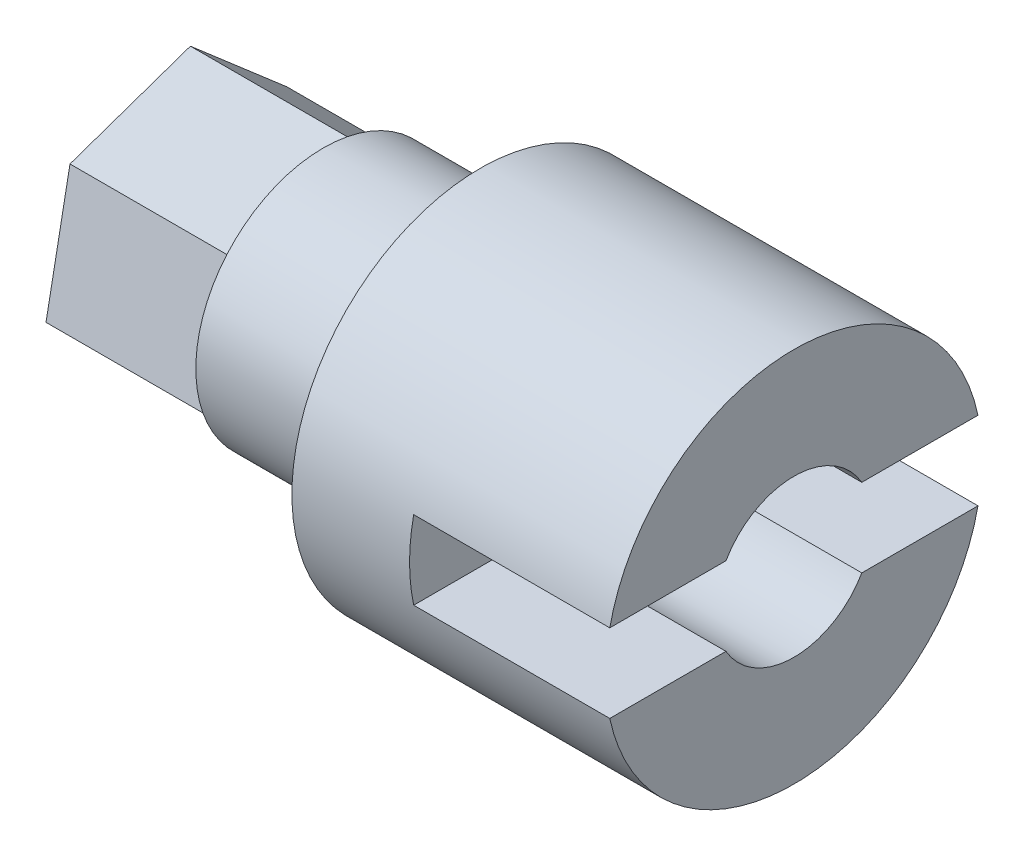
ISO-10303-21;
HEADER;
FILE_DESCRIPTION(('STEP AP214'),'2;1');
FILE_NAME('part.step','',(''),(''),'','','');
FILE_SCHEMA(('AUTOMOTIVE_DESIGN { 1 0 10303 214 1 1 1 1 }'));
ENDSEC;
DATA;
#1=APPLICATION_CONTEXT('core data for automotive mechanical design processes');
#2=APPLICATION_PROTOCOL_DEFINITION('international standard','automotive_design',2000,#1);
#3=PRODUCT_CONTEXT('',#1,'mechanical');
#4=PRODUCT('Part','Part','',(#3));
#5=PRODUCT_RELATED_PRODUCT_CATEGORY('part','',(#4));
#6=PRODUCT_DEFINITION_FORMATION('','',#4);
#7=PRODUCT_DEFINITION_CONTEXT('part definition',#1,'design');
#8=PRODUCT_DEFINITION('design','',#6,#7);
#9=PRODUCT_DEFINITION_SHAPE('','',#8);
#10=(LENGTH_UNIT() NAMED_UNIT(*) SI_UNIT(.MILLI.,.METRE.));
#11=(NAMED_UNIT(*) PLANE_ANGLE_UNIT() SI_UNIT($,.RADIAN.));
#12=(NAMED_UNIT(*) SI_UNIT($,.STERADIAN.) SOLID_ANGLE_UNIT());
#13=UNCERTAINTY_MEASURE_WITH_UNIT(LENGTH_MEASURE(1.E-05),#10,'distance_accuracy_value','');
#14=(GEOMETRIC_REPRESENTATION_CONTEXT(3) GLOBAL_UNCERTAINTY_ASSIGNED_CONTEXT((#13)) GLOBAL_UNIT_ASSIGNED_CONTEXT((#10,
#11,#12)) REPRESENTATION_CONTEXT('',''));
#15=CARTESIAN_POINT('',(0.,0.,0.));
#16=DIRECTION('',(0.,0.,1.));
#17=DIRECTION('',(1.,0.,0.));
#18=AXIS2_PLACEMENT_3D('',#15,#16,#17);
#19=CARTESIAN_POINT('',(-8.,0.,0.));
#20=DIRECTION('',(1.,0.,0.));
#21=DIRECTION('',(0.,0.,-1.));
#22=AXIS2_PLACEMENT_3D('',#19,#20,#21);
#23=CYLINDRICAL_SURFACE('',#22,3.25);
#24=CARTESIAN_POINT('',(0.,0.,0.));
#25=DIRECTION('',(1.,0.,0.));
#26=DIRECTION('',(0.,0.,-1.));
#27=AXIS2_PLACEMENT_3D('',#24,#25,#26);
#28=CIRCLE('',#27,3.25);
#29=CARTESIAN_POINT('',(0.,0.,-3.25));
#30=VERTEX_POINT('',#29);
#31=EDGE_CURVE('E179',#30,#30,#28,.F.);
#32=ORIENTED_EDGE('',*,*,#31,.T.);
#33=EDGE_LOOP('',(#32));
#34=FACE_BOUND('',#33,.T.);
#35=CARTESIAN_POINT('',(-4.,0.,0.));
#36=DIRECTION('',(-1.,0.,0.));
#37=DIRECTION('',(0.,0.,1.));
#38=AXIS2_PLACEMENT_3D('',#35,#36,#37);
#39=CIRCLE('',#38,3.25);
#40=CARTESIAN_POINT('',(-4.,1.06629726237297,-3.07009937107187));
#41=VERTEX_POINT('',#40);
#42=CARTESIAN_POINT('',(-4.,-2.12563541630438,-2.45849020273673));
#43=VERTEX_POINT('',#42);
#44=EDGE_CURVE('E12',#41,#43,#39,.T.);
#45=ORIENTED_EDGE('',*,*,#44,.F.);
#46=CARTESIAN_POINT('',(-4.,3.19193267867735,-0.611609168335137));
#47=VERTEX_POINT('',#46);
#48=EDGE_CURVE('E45',#47,#41,#39,.T.);
#49=ORIENTED_EDGE('',*,*,#48,.F.);
#50=CARTESIAN_POINT('',(-4.,2.12563541630438,2.45849020273673));
#51=VERTEX_POINT('',#50);
#52=EDGE_CURVE('E147',#51,#47,#39,.T.);
#53=ORIENTED_EDGE('',*,*,#52,.F.);
#54=CARTESIAN_POINT('',(-4.,-1.06629726237298,3.07009937107187));
#55=VERTEX_POINT('',#54);
#56=EDGE_CURVE('E180',#55,#51,#39,.T.);
#57=ORIENTED_EDGE('',*,*,#56,.F.);
#58=CARTESIAN_POINT('',(-4.,-3.19193267867735,0.611609168335137));
#59=VERTEX_POINT('',#58);
#60=EDGE_CURVE('E177',#59,#55,#39,.T.);
#61=ORIENTED_EDGE('',*,*,#60,.F.);
#62=EDGE_CURVE('E40',#43,#59,#39,.T.);
#63=ORIENTED_EDGE('',*,*,#62,.F.);
#64=EDGE_LOOP('',(#45,#49,#53,#57,#61,#63));
#65=FACE_BOUND('',#64,.T.);
#66=ADVANCED_FACE('F36',(#34,#65),#23,.T.);
#67=CARTESIAN_POINT('',(-8.,0.,0.));
#68=DIRECTION('',(-1.,0.,0.));
#69=DIRECTION('',(0.,0.,1.));
#70=AXIS2_PLACEMENT_3D('',#67,#68,#69);
#71=PLANE('',#70);
#72=CARTESIAN_POINT('',(-8.,0.,0.));
#73=DIRECTION('',(-1.,0.,0.));
#74=DIRECTION('',(0.,0.,1.));
#75=AXIS2_PLACEMENT_3D('',#72,#73,#74);
#76=CIRCLE('',#75,1.35);
#77=CARTESIAN_POINT('',(-8.,0.,1.35));
#78=VERTEX_POINT('',#77);
#79=EDGE_CURVE('E245',#78,#78,#76,.T.);
#80=ORIENTED_EDGE('',*,*,#79,.F.);
#81=EDGE_LOOP('',(#80));
#82=FACE_BOUND('',#81,.T.);
#83=DIRECTION('',(0.,0.328091465345531,-0.944645960329806));
#84=VECTOR('',#83,1.);
#85=CARTESIAN_POINT('',(-8.,2.12563541630438,2.45849020273673));
#86=LINE('',#85,#84);
#87=CARTESIAN_POINT('',(-8.,2.12563541630438,2.45849020273673));
#88=VERTEX_POINT('',#87);
#89=CARTESIAN_POINT('',(-8.,3.19193267867735,-0.611609168335137));
#90=VERTEX_POINT('',#89);
#91=EDGE_CURVE('E172',#88,#90,#86,.T.);
#92=ORIENTED_EDGE('',*,*,#91,.T.);
#93=DIRECTION('',(0.,-0.654041666555194,-0.756458523918995));
#94=VECTOR('',#93,1.);
#95=CARTESIAN_POINT('',(-8.,3.19193267867735,-0.611609168335137));
#96=LINE('',#95,#94);
#97=CARTESIAN_POINT('',(-8.,1.06629726237297,-3.07009937107187));
#98=VERTEX_POINT('',#97);
#99=EDGE_CURVE('E266',#90,#98,#96,.T.);
#100=ORIENTED_EDGE('',*,*,#99,.T.);
#101=DIRECTION('',(0.,-0.982133131900725,0.188187436410812));
#102=VECTOR('',#101,1.);
#103=CARTESIAN_POINT('',(-8.,1.06629726237297,-3.07009937107187));
#104=LINE('',#103,#102);
#105=CARTESIAN_POINT('',(-8.,-2.12563541630439,-2.45849020273673));
#106=VERTEX_POINT('',#105);
#107=EDGE_CURVE('E157',#98,#106,#104,.T.);
#108=ORIENTED_EDGE('',*,*,#107,.T.);
#109=DIRECTION('',(0.,-0.328091465345531,0.944645960329806));
#110=VECTOR('',#109,1.);
#111=CARTESIAN_POINT('',(-8.,-2.12563541630438,-2.45849020273673));
#112=LINE('',#111,#110);
#113=CARTESIAN_POINT('',(-8.,-3.19193267867735,0.611609168335137));
#114=VERTEX_POINT('',#113);
#115=EDGE_CURVE('E60',#106,#114,#112,.T.);
#116=ORIENTED_EDGE('',*,*,#115,.T.);
#117=DIRECTION('',(0.,0.654041666555194,0.756458523918995));
#118=VECTOR('',#117,1.);
#119=CARTESIAN_POINT('',(-8.,-3.19193267867735,0.611609168335137));
#120=LINE('',#119,#118);
#121=CARTESIAN_POINT('',(-8.,-1.06629726237298,3.07009937107187));
#122=VERTEX_POINT('',#121);
#123=EDGE_CURVE('E261',#114,#122,#120,.T.);
#124=ORIENTED_EDGE('',*,*,#123,.T.);
#125=DIRECTION('',(0.,0.982133131900725,-0.188187436410811));
#126=VECTOR('',#125,1.);
#127=CARTESIAN_POINT('',(-8.,-1.06629726237298,3.07009937107187));
#128=LINE('',#127,#126);
#129=EDGE_CURVE('E258',#122,#88,#128,.T.);
#130=ORIENTED_EDGE('',*,*,#129,.T.);
#131=EDGE_LOOP('',(#92,#100,#108,#116,#124,#130));
#132=FACE_BOUND('',#131,.T.);
#133=ADVANCED_FACE('F290',(#82,#132),#71,.T.);
#134=CARTESIAN_POINT('',(8.,0.,0.));
#135=DIRECTION('',(-1.,0.,0.));
#136=DIRECTION('',(0.,0.,1.));
#137=AXIS2_PLACEMENT_3D('',#134,#135,#136);
#138=CYLINDRICAL_SURFACE('',#137,2.);
#139=DIRECTION('',(-1.,0.,0.));
#140=VECTOR('',#139,1.);
#141=CARTESIAN_POINT('',(8.,1.,1.73205080756888));
#142=LINE('',#141,#140);
#143=CARTESIAN_POINT('',(3.,1.,1.73205080756888));
#144=VERTEX_POINT('',#143);
#145=CARTESIAN_POINT('',(8.,1.,1.73205080756888));
#146=VERTEX_POINT('',#145);
#147=EDGE_CURVE('E182',#144,#146,#142,.F.);
#148=ORIENTED_EDGE('',*,*,#147,.F.);
#149=CARTESIAN_POINT('',(3.,0.,0.));
#150=DIRECTION('',(1.,0.,0.));
#151=DIRECTION('',(0.,0.,-1.));
#152=AXIS2_PLACEMENT_3D('',#149,#150,#151);
#153=CIRCLE('',#152,2.);
#154=CARTESIAN_POINT('',(3.,-1.,1.73205080756888));
#155=VERTEX_POINT('',#154);
#156=EDGE_CURVE('E190',#144,#155,#153,.T.);
#157=ORIENTED_EDGE('',*,*,#156,.T.);
#158=DIRECTION('',(-1.,0.,0.));
#159=VECTOR('',#158,1.);
#160=CARTESIAN_POINT('',(8.,-1.,1.73205080756888));
#161=LINE('',#160,#159);
#162=CARTESIAN_POINT('',(8.,-1.,1.73205080756888));
#163=VERTEX_POINT('',#162);
#164=EDGE_CURVE('E185',#163,#155,#161,.T.);
#165=ORIENTED_EDGE('',*,*,#164,.F.);
#166=CARTESIAN_POINT('',(8.,0.,0.));
#167=DIRECTION('',(1.,0.,0.));
#168=DIRECTION('',(0.,0.,-1.));
#169=AXIS2_PLACEMENT_3D('',#166,#167,#168);
#170=CIRCLE('',#169,2.);
#171=CARTESIAN_POINT('',(8.,-1.,-1.73205080756888));
#172=VERTEX_POINT('',#171);
#173=EDGE_CURVE('E209',#163,#172,#170,.T.);
#174=ORIENTED_EDGE('',*,*,#173,.T.);
#175=DIRECTION('',(-1.,0.,0.));
#176=VECTOR('',#175,1.);
#177=CARTESIAN_POINT('',(8.,-1.,-1.73205080756888));
#178=LINE('',#177,#176);
#179=CARTESIAN_POINT('',(3.,-1.,-1.73205080756888));
#180=VERTEX_POINT('',#179);
#181=EDGE_CURVE('E194',#180,#172,#178,.F.);
#182=ORIENTED_EDGE('',*,*,#181,.F.);
#183=CARTESIAN_POINT('',(3.,1.,-1.73205080756888));
#184=VERTEX_POINT('',#183);
#185=EDGE_CURVE('E196',#180,#184,#153,.T.);
#186=ORIENTED_EDGE('',*,*,#185,.T.);
#187=DIRECTION('',(-1.,0.,0.));
#188=VECTOR('',#187,1.);
#189=CARTESIAN_POINT('',(8.,1.,-1.73205080756888));
#190=LINE('',#189,#188);
#191=CARTESIAN_POINT('',(8.,1.,-1.73205080756888));
#192=VERTEX_POINT('',#191);
#193=EDGE_CURVE('E191',#192,#184,#190,.T.);
#194=ORIENTED_EDGE('',*,*,#193,.F.);
#195=EDGE_CURVE('E204',#192,#146,#170,.T.);
#196=ORIENTED_EDGE('',*,*,#195,.T.);
#197=EDGE_LOOP('',(#148,#157,#165,#174,#182,#186,#194,#196));
#198=FACE_BOUND('',#197,.T.);
#199=CARTESIAN_POINT('',(2.,0.,0.));
#200=DIRECTION('',(-1.,0.,0.));
#201=DIRECTION('',(0.,0.,1.));
#202=AXIS2_PLACEMENT_3D('',#199,#200,#201);
#203=CIRCLE('',#202,2.);
#204=CARTESIAN_POINT('',(2.,0.,2.));
#205=VERTEX_POINT('',#204);
#206=EDGE_CURVE('E232',#205,#205,#203,.T.);
#207=ORIENTED_EDGE('',*,*,#206,.T.);
#208=EDGE_LOOP('',(#207));
#209=FACE_BOUND('',#208,.T.);
#210=ADVANCED_FACE('F296',(#198,#209),#138,.F.);
#211=CARTESIAN_POINT('',(8.,0.,0.));
#212=DIRECTION('',(1.,0.,0.));
#213=DIRECTION('',(0.,0.,-1.));
#214=AXIS2_PLACEMENT_3D('',#211,#212,#213);
#215=PLANE('',#214);
#216=DIRECTION('',(0.,0.,1.));
#217=VECTOR('',#216,1.);
#218=CARTESIAN_POINT('',(8.,1.,5.97471437399122));
#219=LINE('',#218,#217);
#220=CARTESIAN_POINT('',(8.,1.,-4.6946778377222));
#221=VERTEX_POINT('',#220);
#222=EDGE_CURVE('E228',#221,#192,#219,.T.);
#223=ORIENTED_EDGE('',*,*,#222,.F.);
#224=CARTESIAN_POINT('',(8.,0.,0.));
#225=DIRECTION('',(1.,0.,0.));
#226=DIRECTION('',(0.,0.,-1.));
#227=AXIS2_PLACEMENT_3D('',#224,#225,#226);
#228=CIRCLE('',#227,4.8);
#229=CARTESIAN_POINT('',(8.,1.,4.6946778377222));
#230=VERTEX_POINT('',#229);
#231=EDGE_CURVE('E199',#221,#230,#228,.T.);
#232=ORIENTED_EDGE('',*,*,#231,.T.);
#233=EDGE_CURVE('E226',#146,#230,#219,.T.);
#234=ORIENTED_EDGE('',*,*,#233,.F.);
#235=ORIENTED_EDGE('',*,*,#195,.F.);
#236=EDGE_LOOP('',(#223,#232,#234,#235));
#237=FACE_BOUND('',#236,.T.);
#238=ADVANCED_FACE('F322',(#237),#215,.T.);
#239=DIRECTION('',(0.,0.,-1.));
#240=VECTOR('',#239,1.);
#241=CARTESIAN_POINT('',(8.,-1.,5.97471437399122));
#242=LINE('',#241,#240);
#243=CARTESIAN_POINT('',(8.,-1.,4.6946778377222));
#244=VERTEX_POINT('',#243);
#245=EDGE_CURVE('E229',#244,#163,#242,.T.);
#246=ORIENTED_EDGE('',*,*,#245,.F.);
#247=CARTESIAN_POINT('',(8.,-1.,-4.6946778377222));
#248=VERTEX_POINT('',#247);
#249=EDGE_CURVE('E203',#244,#248,#228,.T.);
#250=ORIENTED_EDGE('',*,*,#249,.T.);
#251=EDGE_CURVE('E230',#172,#248,#242,.T.);
#252=ORIENTED_EDGE('',*,*,#251,.F.);
#253=ORIENTED_EDGE('',*,*,#173,.F.);
#254=EDGE_LOOP('',(#246,#250,#252,#253));
#255=FACE_BOUND('',#254,.T.);
#256=ADVANCED_FACE('F324',(#255),#215,.T.);
#257=CARTESIAN_POINT('',(0.,0.,0.));
#258=DIRECTION('',(1.,0.,0.));
#259=DIRECTION('',(0.,0.,-1.));
#260=AXIS2_PLACEMENT_3D('',#257,#258,#259);
#261=PLANE('',#260);
#262=ORIENTED_EDGE('',*,*,#31,.F.);
#263=EDGE_LOOP('',(#262));
#264=FACE_BOUND('',#263,.T.);
#265=CARTESIAN_POINT('',(0.,0.,0.));
#266=DIRECTION('',(1.,0.,0.));
#267=DIRECTION('',(0.,0.,-1.));
#268=AXIS2_PLACEMENT_3D('',#265,#266,#267);
#269=CIRCLE('',#268,4.8);
#270=CARTESIAN_POINT('',(0.,0.,-4.8));
#271=VERTEX_POINT('',#270);
#272=EDGE_CURVE('E200',#271,#271,#269,.T.);
#273=ORIENTED_EDGE('',*,*,#272,.F.);
#274=EDGE_LOOP('',(#273));
#275=FACE_BOUND('',#274,.T.);
#276=ADVANCED_FACE('F326',(#264,#275),#261,.F.);
#277=CARTESIAN_POINT('',(8.,0.,0.));
#278=DIRECTION('',(-1.,0.,0.));
#279=DIRECTION('',(0.,0.,1.));
#280=AXIS2_PLACEMENT_3D('',#277,#278,#279);
#281=CYLINDRICAL_SURFACE('',#280,4.8);
#282=CARTESIAN_POINT('',(3.,0.,0.));
#283=DIRECTION('',(1.,0.,0.));
#284=DIRECTION('',(0.,0.,-1.));
#285=AXIS2_PLACEMENT_3D('',#282,#283,#284);
#286=CIRCLE('',#285,4.8);
#287=CARTESIAN_POINT('',(3.,1.,4.6946778377222));
#288=VERTEX_POINT('',#287);
#289=CARTESIAN_POINT('',(3.,-1.,4.6946778377222));
#290=VERTEX_POINT('',#289);
#291=EDGE_CURVE('E222',#288,#290,#286,.T.);
#292=ORIENTED_EDGE('',*,*,#291,.F.);
#293=DIRECTION('',(-1.,0.,0.));
#294=VECTOR('',#293,1.);
#295=CARTESIAN_POINT('',(8.,1.,4.6946778377222));
#296=LINE('',#295,#294);
#297=EDGE_CURVE('E213',#288,#230,#296,.F.);
#298=ORIENTED_EDGE('',*,*,#297,.T.);
#299=ORIENTED_EDGE('',*,*,#231,.F.);
#300=DIRECTION('',(-1.,0.,0.));
#301=VECTOR('',#300,1.);
#302=CARTESIAN_POINT('',(8.,1.,-4.6946778377222));
#303=LINE('',#302,#301);
#304=CARTESIAN_POINT('',(3.,1.,-4.6946778377222));
#305=VERTEX_POINT('',#304);
#306=EDGE_CURVE('E210',#221,#305,#303,.T.);
#307=ORIENTED_EDGE('',*,*,#306,.T.);
#308=CARTESIAN_POINT('',(3.,-1.,-4.6946778377222));
#309=VERTEX_POINT('',#308);
#310=EDGE_CURVE('E223',#309,#305,#286,.T.);
#311=ORIENTED_EDGE('',*,*,#310,.F.);
#312=DIRECTION('',(-1.,0.,0.));
#313=VECTOR('',#312,1.);
#314=CARTESIAN_POINT('',(8.,-1.,-4.6946778377222));
#315=LINE('',#314,#313);
#316=EDGE_CURVE('E219',#309,#248,#315,.F.);
#317=ORIENTED_EDGE('',*,*,#316,.T.);
#318=ORIENTED_EDGE('',*,*,#249,.F.);
#319=DIRECTION('',(-1.,0.,0.));
#320=VECTOR('',#319,1.);
#321=CARTESIAN_POINT('',(8.,-1.,4.6946778377222));
#322=LINE('',#321,#320);
#323=EDGE_CURVE('E216',#244,#290,#322,.T.);
#324=ORIENTED_EDGE('',*,*,#323,.T.);
#325=EDGE_LOOP('',(#292,#298,#299,#307,#311,#317,#318,#324));
#326=FACE_BOUND('',#325,.T.);
#327=ORIENTED_EDGE('',*,*,#272,.T.);
#328=EDGE_LOOP('',(#327));
#329=FACE_BOUND('',#328,.T.);
#330=ADVANCED_FACE('F38',(#326,#329),#281,.T.);
#331=CARTESIAN_POINT('',(3.,0.,0.));
#332=DIRECTION('',(1.,0.,0.));
#333=DIRECTION('',(0.,0.,-1.));
#334=AXIS2_PLACEMENT_3D('',#331,#332,#333);
#335=PLANE('',#334);
#336=ORIENTED_EDGE('',*,*,#310,.T.);
#337=DIRECTION('',(0.,0.,1.));
#338=VECTOR('',#337,1.);
#339=CARTESIAN_POINT('',(3.,1.,5.97471437399122));
#340=LINE('',#339,#338);
#341=EDGE_CURVE('E225',#305,#184,#340,.T.);
#342=ORIENTED_EDGE('',*,*,#341,.T.);
#343=ORIENTED_EDGE('',*,*,#185,.F.);
#344=DIRECTION('',(0.,0.,-1.));
#345=VECTOR('',#344,1.);
#346=CARTESIAN_POINT('',(3.,-1.,5.97471437399122));
#347=LINE('',#346,#345);
#348=EDGE_CURVE('E237',#180,#309,#347,.T.);
#349=ORIENTED_EDGE('',*,*,#348,.T.);
#350=EDGE_LOOP('',(#336,#342,#343,#349));
#351=FACE_BOUND('',#350,.T.);
#352=ADVANCED_FACE('F310',(#351),#335,.T.);
#353=CARTESIAN_POINT('',(3.,-1.,5.97471437399122));
#354=DIRECTION('',(0.,-1.,0.));
#355=DIRECTION('',(0.,0.,-1.));
#356=AXIS2_PLACEMENT_3D('',#353,#354,#355);
#357=PLANE('',#356);
#358=ORIENTED_EDGE('',*,*,#348,.F.);
#359=ORIENTED_EDGE('',*,*,#181,.T.);
#360=ORIENTED_EDGE('',*,*,#251,.T.);
#361=ORIENTED_EDGE('',*,*,#316,.F.);
#362=EDGE_LOOP('',(#358,#359,#360,#361));
#363=FACE_BOUND('',#362,.T.);
#364=ADVANCED_FACE('F315',(#363),#357,.F.);
#365=CARTESIAN_POINT('',(3.,1.,5.97471437399122));
#366=DIRECTION('',(0.,1.,0.));
#367=DIRECTION('',(0.,0.,1.));
#368=AXIS2_PLACEMENT_3D('',#365,#366,#367);
#369=PLANE('',#368);
#370=ORIENTED_EDGE('',*,*,#222,.T.);
#371=ORIENTED_EDGE('',*,*,#193,.T.);
#372=ORIENTED_EDGE('',*,*,#341,.F.);
#373=ORIENTED_EDGE('',*,*,#306,.F.);
#374=EDGE_LOOP('',(#370,#371,#372,#373));
#375=FACE_BOUND('',#374,.T.);
#376=ADVANCED_FACE('F311',(#375),#369,.F.);
#377=EDGE_CURVE('E233',#144,#288,#340,.T.);
#378=ORIENTED_EDGE('',*,*,#377,.F.);
#379=ORIENTED_EDGE('',*,*,#147,.T.);
#380=ORIENTED_EDGE('',*,*,#233,.T.);
#381=ORIENTED_EDGE('',*,*,#297,.F.);
#382=EDGE_LOOP('',(#378,#379,#380,#381));
#383=FACE_BOUND('',#382,.T.);
#384=ADVANCED_FACE('F314',(#383),#369,.F.);
#385=ORIENTED_EDGE('',*,*,#245,.T.);
#386=ORIENTED_EDGE('',*,*,#164,.T.);
#387=EDGE_CURVE('E236',#290,#155,#347,.T.);
#388=ORIENTED_EDGE('',*,*,#387,.F.);
#389=ORIENTED_EDGE('',*,*,#323,.F.);
#390=EDGE_LOOP('',(#385,#386,#388,#389));
#391=FACE_BOUND('',#390,.T.);
#392=ADVANCED_FACE('F308',(#391),#357,.F.);
#393=ORIENTED_EDGE('',*,*,#291,.T.);
#394=ORIENTED_EDGE('',*,*,#387,.T.);
#395=ORIENTED_EDGE('',*,*,#156,.F.);
#396=ORIENTED_EDGE('',*,*,#377,.T.);
#397=EDGE_LOOP('',(#393,#394,#395,#396));
#398=FACE_BOUND('',#397,.T.);
#399=ADVANCED_FACE('F304',(#398),#335,.T.);
#400=CARTESIAN_POINT('',(2.,0.,0.));
#401=DIRECTION('',(-1.,0.,0.));
#402=DIRECTION('',(0.,0.,1.));
#403=AXIS2_PLACEMENT_3D('',#400,#401,#402);
#404=PLANE('',#403);
#405=CARTESIAN_POINT('',(2.,0.,0.));
#406=DIRECTION('',(-1.,0.,0.));
#407=DIRECTION('',(0.,0.,1.));
#408=AXIS2_PLACEMENT_3D('',#405,#406,#407);
#409=CIRCLE('',#408,1.35);
#410=CARTESIAN_POINT('',(2.,0.,1.35));
#411=VERTEX_POINT('',#410);
#412=EDGE_CURVE('E242',#411,#411,#409,.T.);
#413=ORIENTED_EDGE('',*,*,#412,.T.);
#414=EDGE_LOOP('',(#413));
#415=FACE_BOUND('',#414,.T.);
#416=ORIENTED_EDGE('',*,*,#206,.F.);
#417=EDGE_LOOP('',(#416));
#418=FACE_BOUND('',#417,.T.);
#419=ADVANCED_FACE('F300',(#415,#418),#404,.F.);
#420=CARTESIAN_POINT('',(8.,0.,0.));
#421=DIRECTION('',(-1.,0.,0.));
#422=DIRECTION('',(0.,0.,1.));
#423=AXIS2_PLACEMENT_3D('',#420,#421,#422);
#424=CYLINDRICAL_SURFACE('',#423,1.35);
#425=ORIENTED_EDGE('',*,*,#79,.T.);
#426=EDGE_LOOP('',(#425));
#427=FACE_BOUND('',#426,.T.);
#428=ORIENTED_EDGE('',*,*,#412,.F.);
#429=EDGE_LOOP('',(#428));
#430=FACE_BOUND('',#429,.T.);
#431=ADVANCED_FACE('F303',(#427,#430),#424,.F.);
#432=CARTESIAN_POINT('',(-4.,0.,0.));
#433=DIRECTION('',(-1.,0.,0.));
#434=DIRECTION('',(0.,0.,1.));
#435=AXIS2_PLACEMENT_3D('',#432,#433,#434);
#436=PLANE('',#435);
#437=ORIENTED_EDGE('',*,*,#52,.T.);
#438=DIRECTION('',(0.,0.328091465345531,-0.944645960329806));
#439=VECTOR('',#438,1.);
#440=CARTESIAN_POINT('',(-4.,2.12563541630438,2.45849020273673));
#441=LINE('',#440,#439);
#442=EDGE_CURVE('E162',#51,#47,#441,.T.);
#443=ORIENTED_EDGE('',*,*,#442,.F.);
#444=EDGE_LOOP('',(#437,#443));
#445=FACE_BOUND('',#444,.T.);
#446=ADVANCED_FACE('F286',(#445),#436,.T.);
#447=ORIENTED_EDGE('',*,*,#48,.T.);
#448=DIRECTION('',(0.,-0.654041666555194,-0.756458523918995));
#449=VECTOR('',#448,1.);
#450=CARTESIAN_POINT('',(-4.,3.19193267867735,-0.611609168335137));
#451=LINE('',#450,#449);
#452=EDGE_CURVE('E142',#47,#41,#451,.T.);
#453=ORIENTED_EDGE('',*,*,#452,.F.);
#454=EDGE_LOOP('',(#447,#453));
#455=FACE_BOUND('',#454,.T.);
#456=ADVANCED_FACE('F140',(#455),#436,.T.);
#457=ORIENTED_EDGE('',*,*,#44,.T.);
#458=DIRECTION('',(0.,-0.982133131900725,0.188187436410812));
#459=VECTOR('',#458,1.);
#460=CARTESIAN_POINT('',(-4.,1.06629726237297,-3.07009937107187));
#461=LINE('',#460,#459);
#462=EDGE_CURVE('E154',#41,#43,#461,.T.);
#463=ORIENTED_EDGE('',*,*,#462,.F.);
#464=EDGE_LOOP('',(#457,#463));
#465=FACE_BOUND('',#464,.T.);
#466=ADVANCED_FACE('F165',(#465),#436,.T.);
#467=ORIENTED_EDGE('',*,*,#62,.T.);
#468=DIRECTION('',(0.,-0.328091465345531,0.944645960329806));
#469=VECTOR('',#468,1.);
#470=CARTESIAN_POINT('',(-4.,-2.12563541630438,-2.45849020273673));
#471=LINE('',#470,#469);
#472=EDGE_CURVE('E167',#43,#59,#471,.T.);
#473=ORIENTED_EDGE('',*,*,#472,.F.);
#474=EDGE_LOOP('',(#467,#473));
#475=FACE_BOUND('',#474,.T.);
#476=ADVANCED_FACE('F276',(#475),#436,.T.);
#477=ORIENTED_EDGE('',*,*,#60,.T.);
#478=DIRECTION('',(0.,0.654041666555194,0.756458523918995));
#479=VECTOR('',#478,1.);
#480=CARTESIAN_POINT('',(-4.,-3.19193267867735,0.611609168335137));
#481=LINE('',#480,#479);
#482=EDGE_CURVE('E52',#59,#55,#481,.T.);
#483=ORIENTED_EDGE('',*,*,#482,.F.);
#484=EDGE_LOOP('',(#477,#483));
#485=FACE_BOUND('',#484,.T.);
#486=ADVANCED_FACE('F278',(#485),#436,.T.);
#487=ORIENTED_EDGE('',*,*,#56,.T.);
#488=DIRECTION('',(0.,0.982133131900725,-0.188187436410811));
#489=VECTOR('',#488,1.);
#490=CARTESIAN_POINT('',(-4.,-1.06629726237298,3.07009937107187));
#491=LINE('',#490,#489);
#492=EDGE_CURVE('E269',#55,#51,#491,.T.);
#493=ORIENTED_EDGE('',*,*,#492,.F.);
#494=EDGE_LOOP('',(#487,#493));
#495=FACE_BOUND('',#494,.T.);
#496=ADVANCED_FACE('F284',(#495),#436,.T.);
#497=CARTESIAN_POINT('',(-4.,3.19193267867735,-0.611609168335137));
#498=DIRECTION('',(0.,0.756458523918995,-0.654041666555194));
#499=DIRECTION('',(0.,0.654041666555194,0.756458523918995));
#500=AXIS2_PLACEMENT_3D('',#497,#498,#499);
#501=PLANE('',#500);
#502=ORIENTED_EDGE('',*,*,#99,.F.);
#503=DIRECTION('',(-1.,0.,0.));
#504=VECTOR('',#503,1.);
#505=CARTESIAN_POINT('',(-4.,3.19193267867735,-0.611609168335137));
#506=LINE('',#505,#504);
#507=EDGE_CURVE('E171',#47,#90,#506,.T.);
#508=ORIENTED_EDGE('',*,*,#507,.F.);
#509=ORIENTED_EDGE('',*,*,#452,.T.);
#510=DIRECTION('',(-1.,0.,0.));
#511=VECTOR('',#510,1.);
#512=CARTESIAN_POINT('',(-4.,1.06629726237297,-3.07009937107187));
#513=LINE('',#512,#511);
#514=EDGE_CURVE('E151',#41,#98,#513,.T.);
#515=ORIENTED_EDGE('',*,*,#514,.T.);
#516=EDGE_LOOP('',(#502,#508,#509,#515));
#517=FACE_BOUND('',#516,.T.);
#518=ADVANCED_FACE('F170',(#517),#501,.T.);
#519=CARTESIAN_POINT('',(-4.,2.12563541630438,2.45849020273673));
#520=DIRECTION('',(0.,0.944645960329806,0.328091465345531));
#521=DIRECTION('',(0.,-0.328091465345531,0.944645960329806));
#522=AXIS2_PLACEMENT_3D('',#519,#520,#521);
#523=PLANE('',#522);
#524=ORIENTED_EDGE('',*,*,#91,.F.);
#525=DIRECTION('',(-1.,0.,0.));
#526=VECTOR('',#525,1.);
#527=CARTESIAN_POINT('',(-4.,2.12563541630438,2.45849020273673));
#528=LINE('',#527,#526);
#529=EDGE_CURVE('E253',#51,#88,#528,.T.);
#530=ORIENTED_EDGE('',*,*,#529,.F.);
#531=ORIENTED_EDGE('',*,*,#442,.T.);
#532=ORIENTED_EDGE('',*,*,#507,.T.);
#533=EDGE_LOOP('',(#524,#530,#531,#532));
#534=FACE_BOUND('',#533,.T.);
#535=ADVANCED_FACE('F453',(#534),#523,.T.);
#536=CARTESIAN_POINT('',(-4.,-1.06629726237298,3.07009937107187));
#537=DIRECTION('',(0.,0.188187436410811,0.982133131900725));
#538=DIRECTION('',(0.,-0.982133131900725,0.188187436410811));
#539=AXIS2_PLACEMENT_3D('',#536,#537,#538);
#540=PLANE('',#539);
#541=ORIENTED_EDGE('',*,*,#129,.F.);
#542=DIRECTION('',(-1.,0.,0.));
#543=VECTOR('',#542,1.);
#544=CARTESIAN_POINT('',(-4.,-1.06629726237298,3.07009937107187));
#545=LINE('',#544,#543);
#546=EDGE_CURVE('E251',#55,#122,#545,.T.);
#547=ORIENTED_EDGE('',*,*,#546,.F.);
#548=ORIENTED_EDGE('',*,*,#492,.T.);
#549=ORIENTED_EDGE('',*,*,#529,.T.);
#550=EDGE_LOOP('',(#541,#547,#548,#549));
#551=FACE_BOUND('',#550,.T.);
#552=ADVANCED_FACE('F461',(#551),#540,.T.);
#553=CARTESIAN_POINT('',(-4.,-3.19193267867735,0.611609168335137));
#554=DIRECTION('',(0.,-0.756458523918995,0.654041666555194));
#555=DIRECTION('',(0.,-0.654041666555194,-0.756458523918995));
#556=AXIS2_PLACEMENT_3D('',#553,#554,#555);
#557=PLANE('',#556);
#558=ORIENTED_EDGE('',*,*,#123,.F.);
#559=DIRECTION('',(-1.,0.,0.));
#560=VECTOR('',#559,1.);
#561=CARTESIAN_POINT('',(-4.,-3.19193267867735,0.611609168335137));
#562=LINE('',#561,#560);
#563=EDGE_CURVE('E249',#59,#114,#562,.T.);
#564=ORIENTED_EDGE('',*,*,#563,.F.);
#565=ORIENTED_EDGE('',*,*,#482,.T.);
#566=ORIENTED_EDGE('',*,*,#546,.T.);
#567=EDGE_LOOP('',(#558,#564,#565,#566));
#568=FACE_BOUND('',#567,.T.);
#569=ADVANCED_FACE('F471',(#568),#557,.T.);
#570=CARTESIAN_POINT('',(-4.,-2.12563541630438,-2.45849020273673));
#571=DIRECTION('',(0.,-0.944645960329806,-0.328091465345531));
#572=DIRECTION('',(0.,0.328091465345531,-0.944645960329806));
#573=AXIS2_PLACEMENT_3D('',#570,#571,#572);
#574=PLANE('',#573);
#575=ORIENTED_EDGE('',*,*,#115,.F.);
#576=DIRECTION('',(-1.,0.,0.));
#577=VECTOR('',#576,1.);
#578=CARTESIAN_POINT('',(-4.,-2.12563541630438,-2.45849020273673));
#579=LINE('',#578,#577);
#580=EDGE_CURVE('E161',#43,#106,#579,.T.);
#581=ORIENTED_EDGE('',*,*,#580,.F.);
#582=ORIENTED_EDGE('',*,*,#472,.T.);
#583=ORIENTED_EDGE('',*,*,#563,.T.);
#584=EDGE_LOOP('',(#575,#581,#582,#583));
#585=FACE_BOUND('',#584,.T.);
#586=ADVANCED_FACE('F274',(#585),#574,.T.);
#587=CARTESIAN_POINT('',(-4.,1.06629726237297,-3.07009937107187));
#588=DIRECTION('',(0.,-0.188187436410812,-0.982133131900725));
#589=DIRECTION('',(0.,0.982133131900725,-0.188187436410812));
#590=AXIS2_PLACEMENT_3D('',#587,#588,#589);
#591=PLANE('',#590);
#592=ORIENTED_EDGE('',*,*,#107,.F.);
#593=ORIENTED_EDGE('',*,*,#514,.F.);
#594=ORIENTED_EDGE('',*,*,#462,.T.);
#595=ORIENTED_EDGE('',*,*,#580,.T.);
#596=EDGE_LOOP('',(#592,#593,#594,#595));
#597=FACE_BOUND('',#596,.T.);
#598=ADVANCED_FACE('F153',(#597),#591,.T.);
#599=CLOSED_SHELL('',(#66,#133,#210,#238,#256,#276,#330,#352,#364,#376,#384,#392,#399,#419,#431,
#446,#456,#466,#476,#486,#496,#518,#535,#552,#569,#586,#598));
#600=MANIFOLD_SOLID_BREP('B2',#599);
#601=ADVANCED_BREP_SHAPE_REPRESENTATION('',(#18,#600),#14);
#602=SHAPE_DEFINITION_REPRESENTATION(#9,#601);
ENDSEC;
END-ISO-10303-21;
